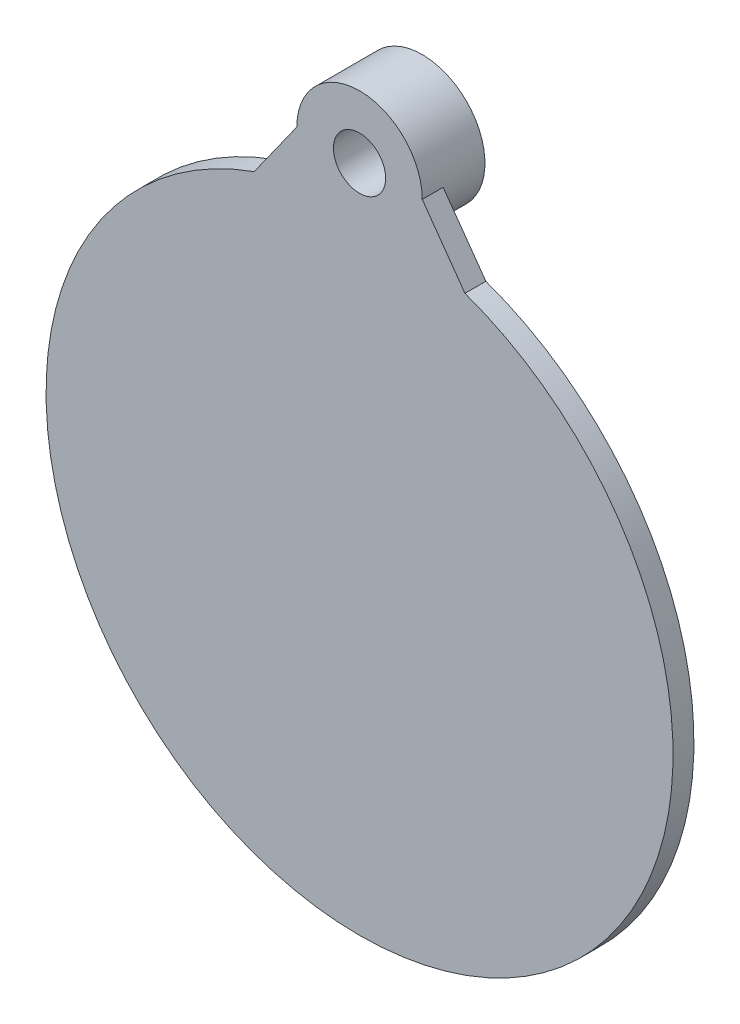
ISO-10303-21;
HEADER;
FILE_DESCRIPTION(('STEP AP214'),'2;1');
FILE_NAME('part.step','',(''),(''),'','','');
FILE_SCHEMA(('AUTOMOTIVE_DESIGN { 1 0 10303 214 1 1 1 1 }'));
ENDSEC;
DATA;
#1=APPLICATION_CONTEXT('core data for automotive mechanical design processes');
#2=APPLICATION_PROTOCOL_DEFINITION('international standard','automotive_design',2000,#1);
#3=PRODUCT_CONTEXT('',#1,'mechanical');
#4=PRODUCT('Part','Part','',(#3));
#5=PRODUCT_RELATED_PRODUCT_CATEGORY('part','',(#4));
#6=PRODUCT_DEFINITION_FORMATION('','',#4);
#7=PRODUCT_DEFINITION_CONTEXT('part definition',#1,'design');
#8=PRODUCT_DEFINITION('design','',#6,#7);
#9=PRODUCT_DEFINITION_SHAPE('','',#8);
#10=(LENGTH_UNIT() NAMED_UNIT(*) SI_UNIT(.MILLI.,.METRE.));
#11=(NAMED_UNIT(*) PLANE_ANGLE_UNIT() SI_UNIT($,.RADIAN.));
#12=(NAMED_UNIT(*) SI_UNIT($,.STERADIAN.) SOLID_ANGLE_UNIT());
#13=UNCERTAINTY_MEASURE_WITH_UNIT(LENGTH_MEASURE(1.E-05),#10,'distance_accuracy_value','');
#14=(GEOMETRIC_REPRESENTATION_CONTEXT(3) GLOBAL_UNCERTAINTY_ASSIGNED_CONTEXT((#13)) GLOBAL_UNIT_ASSIGNED_CONTEXT((#10,
#11,#12)) REPRESENTATION_CONTEXT('',''));
#15=CARTESIAN_POINT('',(0.,0.,0.));
#16=DIRECTION('',(0.,0.,1.));
#17=DIRECTION('',(1.,0.,0.));
#18=AXIS2_PLACEMENT_3D('',#15,#16,#17);
#19=CARTESIAN_POINT('',(0.,53.975,0.));
#20=DIRECTION('',(0.,0.,1.));
#21=DIRECTION('',(1.,0.,0.));
#22=AXIS2_PLACEMENT_3D('',#19,#20,#21);
#23=PLANE('',#22);
#24=CARTESIAN_POINT('',(0.,0.,0.));
#25=DIRECTION('',(0.,0.,1.));
#26=DIRECTION('',(1.,0.,0.));
#27=AXIS2_PLACEMENT_3D('',#24,#25,#26);
#28=CIRCLE('',#27,37.9);
#29=CARTESIAN_POINT('',(37.9,0.,0.));
#30=VERTEX_POINT('',#29);
#31=EDGE_CURVE('E167',#30,#30,#28,.T.);
#32=ORIENTED_EDGE('',*,*,#31,.T.);
#33=EDGE_LOOP('',(#32));
#34=FACE_BOUND('',#33,.T.);
#35=CARTESIAN_POINT('',(0.,53.975,0.));
#36=DIRECTION('',(0.,0.,-1.));
#37=DIRECTION('',(-1.,0.,0.));
#38=AXIS2_PLACEMENT_3D('',#35,#36,#37);
#39=CIRCLE('',#38,9.525);
#40=CARTESIAN_POINT('',(9.525,53.975,0.));
#41=VERTEX_POINT('',#40);
#42=CARTESIAN_POINT('',(-9.525,53.975,0.));
#43=VERTEX_POINT('',#42);
#44=EDGE_CURVE('E82',#41,#43,#39,.T.);
#45=ORIENTED_EDGE('',*,*,#44,.F.);
#46=DIRECTION('',(-0.579587062418018,0.814910324561944,0.));
#47=VECTOR('',#46,1.);
#48=CARTESIAN_POINT('',(9.525,53.975,0.));
#49=LINE('',#48,#47);
#50=CARTESIAN_POINT('',(16.0134751340849,44.8520817703041,0.));
#51=VERTEX_POINT('',#50);
#52=EDGE_CURVE('E84',#51,#41,#49,.T.);
#53=ORIENTED_EDGE('',*,*,#52,.F.);
#54=CARTESIAN_POINT('',(0.,0.,0.));
#55=DIRECTION('',(0.,0.,1.));
#56=DIRECTION('',(1.,0.,0.));
#57=AXIS2_PLACEMENT_3D('',#54,#55,#56);
#58=CIRCLE('',#57,47.625);
#59=CARTESIAN_POINT('',(-16.0134751340849,44.8520817703041,0.));
#60=VERTEX_POINT('',#59);
#61=EDGE_CURVE('E72',#60,#51,#58,.T.);
#62=ORIENTED_EDGE('',*,*,#61,.F.);
#63=DIRECTION('',(-0.579587062418017,-0.814910324561944,0.));
#64=VECTOR('',#63,1.);
#65=CARTESIAN_POINT('',(-9.525,53.975,0.));
#66=LINE('',#65,#64);
#67=EDGE_CURVE('E65',#43,#60,#66,.T.);
#68=ORIENTED_EDGE('',*,*,#67,.F.);
#69=EDGE_LOOP('',(#45,#53,#62,#68));
#70=FACE_BOUND('',#69,.T.);
#71=ADVANCED_FACE('F33',(#34,#70),#23,.F.);
#72=CARTESIAN_POINT('',(0.,53.975,3.175));
#73=DIRECTION('',(0.,0.,1.));
#74=DIRECTION('',(1.,0.,0.));
#75=AXIS2_PLACEMENT_3D('',#72,#73,#74);
#76=PLANE('',#75);
#77=CARTESIAN_POINT('',(0.,53.975,3.175));
#78=DIRECTION('',(0.,0.,1.));
#79=DIRECTION('',(1.,0.,0.));
#80=AXIS2_PLACEMENT_3D('',#77,#78,#79);
#81=CIRCLE('',#80,9.525);
#82=CARTESIAN_POINT('',(9.525,53.975,3.175));
#83=VERTEX_POINT('',#82);
#84=CARTESIAN_POINT('',(-9.525,53.975,3.175));
#85=VERTEX_POINT('',#84);
#86=EDGE_CURVE('E95',#83,#85,#81,.T.);
#87=ORIENTED_EDGE('',*,*,#86,.T.);
#88=DIRECTION('',(-0.579587062418017,-0.814910324561944,0.));
#89=VECTOR('',#88,1.);
#90=CARTESIAN_POINT('',(-9.525,53.975,3.175));
#91=LINE('',#90,#89);
#92=CARTESIAN_POINT('',(-16.0134751340849,44.8520817703041,3.175));
#93=VERTEX_POINT('',#92);
#94=EDGE_CURVE('E77',#85,#93,#91,.T.);
#95=ORIENTED_EDGE('',*,*,#94,.T.);
#96=CARTESIAN_POINT('',(0.,0.,3.175));
#97=DIRECTION('',(0.,0.,1.));
#98=DIRECTION('',(1.,0.,0.));
#99=AXIS2_PLACEMENT_3D('',#96,#97,#98);
#100=CIRCLE('',#99,47.625);
#101=CARTESIAN_POINT('',(16.0134751340849,44.8520817703041,3.175));
#102=VERTEX_POINT('',#101);
#103=EDGE_CURVE('E102',#93,#102,#100,.T.);
#104=ORIENTED_EDGE('',*,*,#103,.T.);
#105=DIRECTION('',(-0.579587062418018,0.814910324561944,0.));
#106=VECTOR('',#105,1.);
#107=CARTESIAN_POINT('',(9.525,53.975,3.175));
#108=LINE('',#107,#106);
#109=EDGE_CURVE('E50',#102,#83,#108,.T.);
#110=ORIENTED_EDGE('',*,*,#109,.T.);
#111=EDGE_LOOP('',(#87,#95,#104,#110));
#112=FACE_BOUND('',#111,.T.);
#113=CARTESIAN_POINT('',(0.,53.975,3.175));
#114=DIRECTION('',(0.,0.,1.));
#115=DIRECTION('',(1.,0.,0.));
#116=AXIS2_PLACEMENT_3D('',#113,#114,#115);
#117=CIRCLE('',#116,3.96875);
#118=CARTESIAN_POINT('',(3.96875,53.975,3.175));
#119=VERTEX_POINT('',#118);
#120=EDGE_CURVE('E168',#119,#119,#117,.T.);
#121=ORIENTED_EDGE('',*,*,#120,.F.);
#122=EDGE_LOOP('',(#121));
#123=FACE_BOUND('',#122,.T.);
#124=ADVANCED_FACE('F131',(#112,#123),#76,.T.);
#125=CARTESIAN_POINT('',(0.,53.975,3.175));
#126=DIRECTION('',(0.,0.,-1.));
#127=DIRECTION('',(-1.,0.,0.));
#128=AXIS2_PLACEMENT_3D('',#125,#126,#127);
#129=CYLINDRICAL_SURFACE('',#128,9.525);
#130=DIRECTION('',(0.,0.,-1.));
#131=VECTOR('',#130,1.);
#132=CARTESIAN_POINT('',(9.525,53.975,3.175));
#133=LINE('',#132,#131);
#134=EDGE_CURVE('E92',#83,#41,#133,.T.);
#135=ORIENTED_EDGE('',*,*,#134,.T.);
#136=ORIENTED_EDGE('',*,*,#44,.T.);
#137=DIRECTION('',(0.,0.,-1.));
#138=VECTOR('',#137,1.);
#139=CARTESIAN_POINT('',(-9.525,53.975,3.175));
#140=LINE('',#139,#138);
#141=EDGE_CURVE('E107',#85,#43,#140,.T.);
#142=ORIENTED_EDGE('',*,*,#141,.F.);
#143=ORIENTED_EDGE('',*,*,#86,.F.);
#144=EDGE_LOOP('',(#135,#136,#142,#143));
#145=FACE_BOUND('',#144,.T.);
#146=CARTESIAN_POINT('',(0.,53.975,-6.35));
#147=DIRECTION('',(0.,0.,-1.));
#148=DIRECTION('',(-1.,0.,0.));
#149=AXIS2_PLACEMENT_3D('',#146,#147,#148);
#150=CIRCLE('',#149,9.525);
#151=CARTESIAN_POINT('',(-9.525,53.975,-6.35));
#152=VERTEX_POINT('',#151);
#153=EDGE_CURVE('E88',#152,#152,#150,.T.);
#154=ORIENTED_EDGE('',*,*,#153,.F.);
#155=EDGE_LOOP('',(#154));
#156=FACE_BOUND('',#155,.T.);
#157=ADVANCED_FACE('F97',(#145,#156),#129,.T.);
#158=CARTESIAN_POINT('',(-9.525,53.975,3.175));
#159=DIRECTION('',(0.814910324561944,-0.579587062418017,0.));
#160=DIRECTION('',(0.579587062418017,0.814910324561944,0.));
#161=AXIS2_PLACEMENT_3D('',#158,#159,#160);
#162=PLANE('',#161);
#163=ORIENTED_EDGE('',*,*,#67,.T.);
#164=DIRECTION('',(0.,0.,-1.));
#165=VECTOR('',#164,1.);
#166=CARTESIAN_POINT('',(-16.0134751340849,44.8520817703041,3.175));
#167=LINE('',#166,#165);
#168=EDGE_CURVE('E100',#93,#60,#167,.T.);
#169=ORIENTED_EDGE('',*,*,#168,.F.);
#170=ORIENTED_EDGE('',*,*,#94,.F.);
#171=ORIENTED_EDGE('',*,*,#141,.T.);
#172=EDGE_LOOP('',(#163,#169,#170,#171));
#173=FACE_BOUND('',#172,.T.);
#174=ADVANCED_FACE('F146',(#173),#162,.F.);
#175=CARTESIAN_POINT('',(0.,0.,3.175));
#176=DIRECTION('',(0.,0.,-1.));
#177=DIRECTION('',(-1.,0.,0.));
#178=AXIS2_PLACEMENT_3D('',#175,#176,#177);
#179=CYLINDRICAL_SURFACE('',#178,47.625);
#180=ORIENTED_EDGE('',*,*,#61,.T.);
#181=DIRECTION('',(0.,0.,-1.));
#182=VECTOR('',#181,1.);
#183=CARTESIAN_POINT('',(16.0134751340849,44.8520817703041,3.175));
#184=LINE('',#183,#182);
#185=EDGE_CURVE('E94',#102,#51,#184,.T.);
#186=ORIENTED_EDGE('',*,*,#185,.F.);
#187=ORIENTED_EDGE('',*,*,#103,.F.);
#188=ORIENTED_EDGE('',*,*,#168,.T.);
#189=EDGE_LOOP('',(#180,#186,#187,#188));
#190=FACE_BOUND('',#189,.T.);
#191=ADVANCED_FACE('F143',(#190),#179,.T.);
#192=CARTESIAN_POINT('',(9.525,53.975,3.175));
#193=DIRECTION('',(-0.814910324561944,-0.579587062418018,0.));
#194=DIRECTION('',(0.579587062418018,-0.814910324561944,0.));
#195=AXIS2_PLACEMENT_3D('',#192,#193,#194);
#196=PLANE('',#195);
#197=ORIENTED_EDGE('',*,*,#52,.T.);
#198=ORIENTED_EDGE('',*,*,#134,.F.);
#199=ORIENTED_EDGE('',*,*,#109,.F.);
#200=ORIENTED_EDGE('',*,*,#185,.T.);
#201=EDGE_LOOP('',(#197,#198,#199,#200));
#202=FACE_BOUND('',#201,.T.);
#203=ADVANCED_FACE('F91',(#202),#196,.F.);
#204=CARTESIAN_POINT('',(0.,53.975,3.175));
#205=DIRECTION('',(0.,0.,-1.));
#206=DIRECTION('',(-1.,0.,0.));
#207=AXIS2_PLACEMENT_3D('',#204,#205,#206);
#208=CYLINDRICAL_SURFACE('',#207,3.96875);
#209=CARTESIAN_POINT('',(0.,53.975,-6.15));
#210=DIRECTION('',(0.,0.,-1.));
#211=DIRECTION('',(-1.,0.,0.));
#212=AXIS2_PLACEMENT_3D('',#209,#210,#211);
#213=CIRCLE('',#212,3.96875);
#214=CARTESIAN_POINT('',(-3.96875,53.975,-6.15));
#215=VERTEX_POINT('',#214);
#216=EDGE_CURVE('E42',#215,#215,#213,.T.);
#217=ORIENTED_EDGE('',*,*,#216,.T.);
#218=EDGE_LOOP('',(#217));
#219=FACE_BOUND('',#218,.T.);
#220=ORIENTED_EDGE('',*,*,#120,.T.);
#221=EDGE_LOOP('',(#220));
#222=FACE_BOUND('',#221,.T.);
#223=ADVANCED_FACE('F117',(#219,#222),#208,.F.);
#224=CARTESIAN_POINT('',(0.,0.,-3.175));
#225=DIRECTION('',(0.,0.,1.));
#226=DIRECTION('',(1.,0.,0.));
#227=AXIS2_PLACEMENT_3D('',#224,#225,#226);
#228=CYLINDRICAL_SURFACE('',#227,37.9);
#229=CARTESIAN_POINT('',(0.,0.,-2.775));
#230=DIRECTION('',(0.,0.,1.));
#231=DIRECTION('',(1.,0.,0.));
#232=AXIS2_PLACEMENT_3D('',#229,#230,#231);
#233=CIRCLE('',#232,37.9);
#234=CARTESIAN_POINT('',(37.9,0.,-2.775));
#235=VERTEX_POINT('',#234);
#236=EDGE_CURVE('E109',#235,#235,#233,.T.);
#237=ORIENTED_EDGE('',*,*,#236,.T.);
#238=EDGE_LOOP('',(#237));
#239=FACE_BOUND('',#238,.T.);
#240=ORIENTED_EDGE('',*,*,#31,.F.);
#241=EDGE_LOOP('',(#240));
#242=FACE_BOUND('',#241,.T.);
#243=ADVANCED_FACE('F156',(#239,#242),#228,.T.);
#244=CARTESIAN_POINT('',(0.,0.,-3.175));
#245=DIRECTION('',(0.,0.,1.));
#246=DIRECTION('',(1.,0.,0.));
#247=AXIS2_PLACEMENT_3D('',#244,#245,#246);
#248=PLANE('',#247);
#249=CARTESIAN_POINT('',(0.,0.,-3.175));
#250=DIRECTION('',(0.,0.,1.));
#251=DIRECTION('',(1.,0.,0.));
#252=AXIS2_PLACEMENT_3D('',#249,#250,#251);
#253=CIRCLE('',#252,37.5);
#254=CARTESIAN_POINT('',(37.5,0.,-3.175));
#255=VERTEX_POINT('',#254);
#256=EDGE_CURVE('E112',#255,#255,#253,.F.);
#257=ORIENTED_EDGE('',*,*,#256,.T.);
#258=EDGE_LOOP('',(#257));
#259=FACE_BOUND('',#258,.T.);
#260=ADVANCED_FACE('F151',(#259),#248,.F.);
#261=CARTESIAN_POINT('',(0.,0.,-2.775));
#262=DIRECTION('',(0.,0.,1.));
#263=DIRECTION('',(1.,0.,0.));
#264=AXIS2_PLACEMENT_3D('',#261,#262,#263);
#265=TOROIDAL_SURFACE('',#264,37.5,0.4);
#266=ORIENTED_EDGE('',*,*,#256,.F.);
#267=EDGE_LOOP('',(#266));
#268=FACE_BOUND('',#267,.T.);
#269=ORIENTED_EDGE('',*,*,#236,.F.);
#270=EDGE_LOOP('',(#269));
#271=FACE_BOUND('',#270,.T.);
#272=ADVANCED_FACE('F126',(#268,#271),#265,.T.);
#273=CARTESIAN_POINT('',(0.,53.975,-6.35));
#274=DIRECTION('',(0.,0.,-1.));
#275=DIRECTION('',(-1.,0.,0.));
#276=AXIS2_PLACEMENT_3D('',#273,#274,#275);
#277=PLANE('',#276);
#278=CARTESIAN_POINT('',(0.,53.975,-6.35));
#279=DIRECTION('',(0.,0.,-1.));
#280=DIRECTION('',(-1.,0.,0.));
#281=AXIS2_PLACEMENT_3D('',#278,#279,#280);
#282=CIRCLE('',#281,4.16875);
#283=CARTESIAN_POINT('',(-4.16875,53.975,-6.35));
#284=VERTEX_POINT('',#283);
#285=EDGE_CURVE('E11',#284,#284,#282,.F.);
#286=ORIENTED_EDGE('',*,*,#285,.T.);
#287=EDGE_LOOP('',(#286));
#288=FACE_BOUND('',#287,.T.);
#289=ORIENTED_EDGE('',*,*,#153,.T.);
#290=EDGE_LOOP('',(#289));
#291=FACE_BOUND('',#290,.T.);
#292=ADVANCED_FACE('F121',(#288,#291),#277,.T.);
#293=CARTESIAN_POINT('',(0.,53.975,-6.15));
#294=DIRECTION('',(0.,0.,-1.));
#295=DIRECTION('',(-1.,0.,0.));
#296=AXIS2_PLACEMENT_3D('',#293,#294,#295);
#297=CONICAL_SURFACE('',#296,3.96875,0.785398163397431);
#298=ORIENTED_EDGE('',*,*,#285,.F.);
#299=EDGE_LOOP('',(#298));
#300=FACE_BOUND('',#299,.T.);
#301=ORIENTED_EDGE('',*,*,#216,.F.);
#302=EDGE_LOOP('',(#301));
#303=FACE_BOUND('',#302,.T.);
#304=ADVANCED_FACE('F35',(#300,#303),#297,.F.);
#305=CLOSED_SHELL('',(#71,#124,#157,#174,#191,#203,#223,#243,#260,#272,#292,#304));
#306=MANIFOLD_SOLID_BREP('B2',#305);
#307=ADVANCED_BREP_SHAPE_REPRESENTATION('',(#18,#306),#14);
#308=SHAPE_DEFINITION_REPRESENTATION(#9,#307);
ENDSEC;
END-ISO-10303-21;
